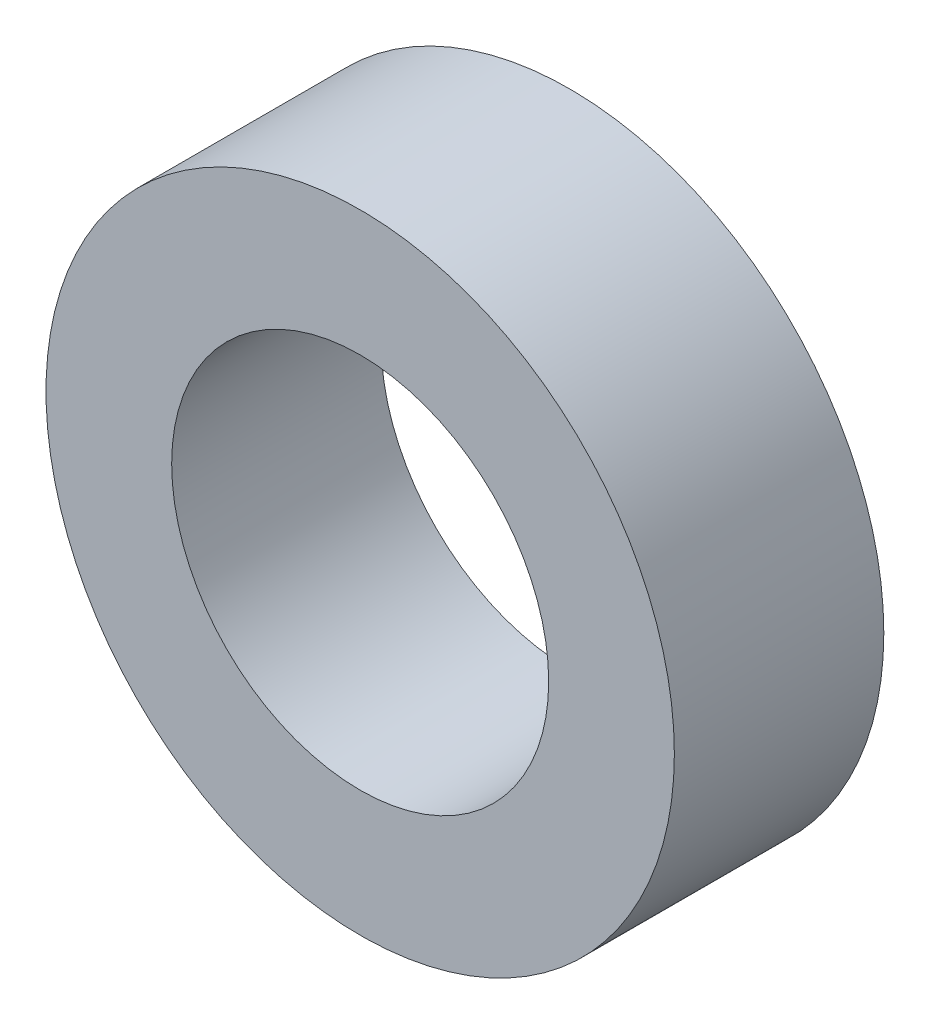
ISO-10303-21;
HEADER;
FILE_DESCRIPTION(('STEP AP214'),'2;1');
FILE_NAME('part.step','',(''),(''),'','','');
FILE_SCHEMA(('AUTOMOTIVE_DESIGN { 1 0 10303 214 1 1 1 1 }'));
ENDSEC;
DATA;
#1=APPLICATION_CONTEXT('core data for automotive mechanical design processes');
#2=APPLICATION_PROTOCOL_DEFINITION('international standard','automotive_design',2000,#1);
#3=PRODUCT_CONTEXT('',#1,'mechanical');
#4=PRODUCT('Part','Part','',(#3));
#5=PRODUCT_RELATED_PRODUCT_CATEGORY('part','',(#4));
#6=PRODUCT_DEFINITION_FORMATION('','',#4);
#7=PRODUCT_DEFINITION_CONTEXT('part definition',#1,'design');
#8=PRODUCT_DEFINITION('design','',#6,#7);
#9=PRODUCT_DEFINITION_SHAPE('','',#8);
#10=(LENGTH_UNIT() NAMED_UNIT(*) SI_UNIT(.MILLI.,.METRE.));
#11=(NAMED_UNIT(*) PLANE_ANGLE_UNIT() SI_UNIT($,.RADIAN.));
#12=(NAMED_UNIT(*) SI_UNIT($,.STERADIAN.) SOLID_ANGLE_UNIT());
#13=UNCERTAINTY_MEASURE_WITH_UNIT(LENGTH_MEASURE(1.E-05),#10,'distance_accuracy_value','');
#14=(GEOMETRIC_REPRESENTATION_CONTEXT(3) GLOBAL_UNCERTAINTY_ASSIGNED_CONTEXT((#13)) GLOBAL_UNIT_ASSIGNED_CONTEXT((#10,
#11,#12)) REPRESENTATION_CONTEXT('',''));
#15=CARTESIAN_POINT('',(0.,0.,0.));
#16=DIRECTION('',(0.,0.,1.));
#17=DIRECTION('',(1.,0.,0.));
#18=AXIS2_PLACEMENT_3D('',#15,#16,#17);
#19=CARTESIAN_POINT('',(0.,0.,5.));
#20=DIRECTION('',(0.,0.,1.));
#21=DIRECTION('',(1.,0.,0.));
#22=AXIS2_PLACEMENT_3D('',#19,#20,#21);
#23=PLANE('',#22);
#24=CARTESIAN_POINT('',(0.,0.,5.));
#25=DIRECTION('',(0.,0.,1.));
#26=DIRECTION('',(1.,0.,0.));
#27=AXIS2_PLACEMENT_3D('',#24,#25,#26);
#28=CIRCLE('',#27,7.5);
#29=CARTESIAN_POINT('',(7.5,0.,5.));
#30=VERTEX_POINT('',#29);
#31=EDGE_CURVE('E10',#30,#30,#28,.T.);
#32=ORIENTED_EDGE('',*,*,#31,.T.);
#33=EDGE_LOOP('',(#32));
#34=FACE_BOUND('',#33,.T.);
#35=CARTESIAN_POINT('',(0.,0.,5.));
#36=DIRECTION('',(0.,0.,1.));
#37=DIRECTION('',(1.,0.,0.));
#38=AXIS2_PLACEMENT_3D('',#35,#36,#37);
#39=CIRCLE('',#38,4.5);
#40=CARTESIAN_POINT('',(4.5,0.,5.));
#41=VERTEX_POINT('',#40);
#42=EDGE_CURVE('E42',#41,#41,#39,.T.);
#43=ORIENTED_EDGE('',*,*,#42,.F.);
#44=EDGE_LOOP('',(#43));
#45=FACE_BOUND('',#44,.T.);
#46=ADVANCED_FACE('F31',(#34,#45),#23,.T.);
#47=CARTESIAN_POINT('',(0.,0.,0.));
#48=DIRECTION('',(0.,0.,1.));
#49=DIRECTION('',(1.,0.,0.));
#50=AXIS2_PLACEMENT_3D('',#47,#48,#49);
#51=PLANE('',#50);
#52=CARTESIAN_POINT('',(0.,0.,0.));
#53=DIRECTION('',(0.,0.,1.));
#54=DIRECTION('',(1.,0.,0.));
#55=AXIS2_PLACEMENT_3D('',#52,#53,#54);
#56=CIRCLE('',#55,7.5);
#57=CARTESIAN_POINT('',(7.5,0.,0.));
#58=VERTEX_POINT('',#57);
#59=EDGE_CURVE('E35',#58,#58,#56,.T.);
#60=ORIENTED_EDGE('',*,*,#59,.F.);
#61=EDGE_LOOP('',(#60));
#62=FACE_BOUND('',#61,.T.);
#63=CARTESIAN_POINT('',(0.,0.,0.));
#64=DIRECTION('',(0.,0.,1.));
#65=DIRECTION('',(1.,0.,0.));
#66=AXIS2_PLACEMENT_3D('',#63,#64,#65);
#67=CIRCLE('',#66,4.5);
#68=CARTESIAN_POINT('',(4.5,0.,0.));
#69=VERTEX_POINT('',#68);
#70=EDGE_CURVE('E44',#69,#69,#67,.T.);
#71=ORIENTED_EDGE('',*,*,#70,.T.);
#72=EDGE_LOOP('',(#71));
#73=FACE_BOUND('',#72,.T.);
#74=ADVANCED_FACE('F54',(#62,#73),#51,.F.);
#75=CARTESIAN_POINT('',(0.,0.,5.));
#76=DIRECTION('',(0.,0.,-1.));
#77=DIRECTION('',(-1.,0.,0.));
#78=AXIS2_PLACEMENT_3D('',#75,#76,#77);
#79=CYLINDRICAL_SURFACE('',#78,7.5);
#80=ORIENTED_EDGE('',*,*,#31,.F.);
#81=EDGE_LOOP('',(#80));
#82=FACE_BOUND('',#81,.T.);
#83=ORIENTED_EDGE('',*,*,#59,.T.);
#84=EDGE_LOOP('',(#83));
#85=FACE_BOUND('',#84,.T.);
#86=ADVANCED_FACE('F33',(#82,#85),#79,.T.);
#87=CARTESIAN_POINT('',(0.,0.,5.));
#88=DIRECTION('',(0.,0.,-1.));
#89=DIRECTION('',(-1.,0.,0.));
#90=AXIS2_PLACEMENT_3D('',#87,#88,#89);
#91=CYLINDRICAL_SURFACE('',#90,4.5);
#92=ORIENTED_EDGE('',*,*,#42,.T.);
#93=EDGE_LOOP('',(#92));
#94=FACE_BOUND('',#93,.T.);
#95=ORIENTED_EDGE('',*,*,#70,.F.);
#96=EDGE_LOOP('',(#95));
#97=FACE_BOUND('',#96,.T.);
#98=ADVANCED_FACE('F50',(#94,#97),#91,.F.);
#99=CLOSED_SHELL('',(#46,#74,#86,#98));
#100=MANIFOLD_SOLID_BREP('B2',#99);
#101=ADVANCED_BREP_SHAPE_REPRESENTATION('',(#18,#100),#14);
#102=SHAPE_DEFINITION_REPRESENTATION(#9,#101);
ENDSEC;
END-ISO-10303-21;
